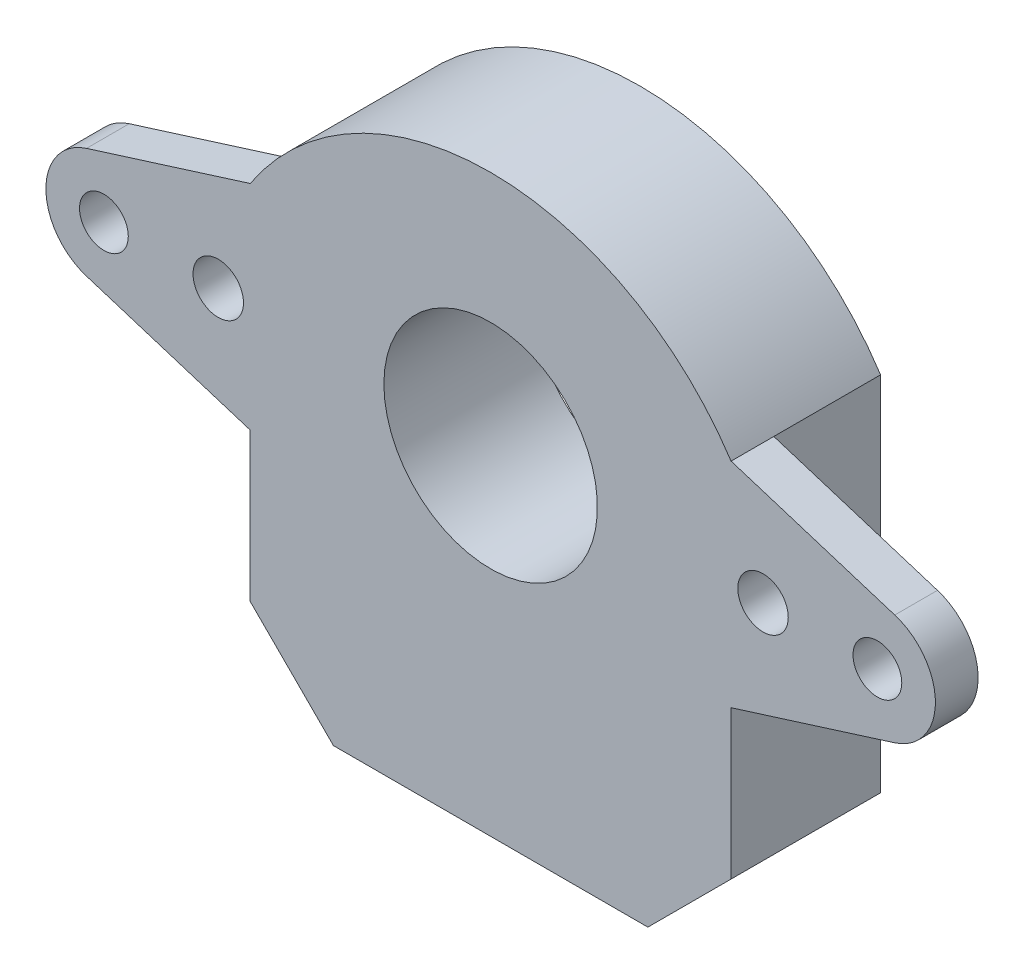
ISO-10303-21;
HEADER;
FILE_DESCRIPTION(('STEP AP214'),'2;1');
FILE_NAME('part.step','',(''),(''),'','','');
FILE_SCHEMA(('AUTOMOTIVE_DESIGN { 1 0 10303 214 1 1 1 1 }'));
ENDSEC;
DATA;
#1=APPLICATION_CONTEXT('core data for automotive mechanical design processes');
#2=APPLICATION_PROTOCOL_DEFINITION('international standard','automotive_design',2000,#1);
#3=PRODUCT_CONTEXT('',#1,'mechanical');
#4=PRODUCT('Part','Part','',(#3));
#5=PRODUCT_RELATED_PRODUCT_CATEGORY('part','',(#4));
#6=PRODUCT_DEFINITION_FORMATION('','',#4);
#7=PRODUCT_DEFINITION_CONTEXT('part definition',#1,'design');
#8=PRODUCT_DEFINITION('design','',#6,#7);
#9=PRODUCT_DEFINITION_SHAPE('','',#8);
#10=(LENGTH_UNIT() NAMED_UNIT(*) SI_UNIT(.MILLI.,.METRE.));
#11=(NAMED_UNIT(*) PLANE_ANGLE_UNIT() SI_UNIT($,.RADIAN.));
#12=(NAMED_UNIT(*) SI_UNIT($,.STERADIAN.) SOLID_ANGLE_UNIT());
#13=UNCERTAINTY_MEASURE_WITH_UNIT(LENGTH_MEASURE(1.E-05),#10,'distance_accuracy_value','');
#14=(GEOMETRIC_REPRESENTATION_CONTEXT(3) GLOBAL_UNCERTAINTY_ASSIGNED_CONTEXT((#13)) GLOBAL_UNIT_ASSIGNED_CONTEXT((#10,
#11,#12)) REPRESENTATION_CONTEXT('',''));
#15=CARTESIAN_POINT('',(0.,0.,0.));
#16=DIRECTION('',(0.,0.,1.));
#17=DIRECTION('',(1.,0.,0.));
#18=AXIS2_PLACEMENT_3D('',#15,#16,#17);
#19=CARTESIAN_POINT('',(14.3,-9.18080428767081,8.89));
#20=DIRECTION('',(-1.,0.,0.));
#21=DIRECTION('',(0.,-1.,0.));
#22=AXIS2_PLACEMENT_3D('',#19,#20,#21);
#23=PLANE('',#22);
#24=DIRECTION('',(0.,1.,0.));
#25=VECTOR('',#24,1.);
#26=CARTESIAN_POINT('',(14.3,0.,6.35));
#27=LINE('',#26,#25);
#28=CARTESIAN_POINT('',(14.3,-0.353985220191791,6.35));
#29=VERTEX_POINT('',#28);
#30=CARTESIAN_POINT('',(14.3,12.3460147798082,6.35));
#31=VERTEX_POINT('',#30);
#32=EDGE_CURVE('E201',#29,#31,#27,.T.);
#33=ORIENTED_EDGE('',*,*,#32,.F.);
#34=DIRECTION('',(0.,0.,1.));
#35=VECTOR('',#34,1.);
#36=CARTESIAN_POINT('',(14.3,-0.353985220191791,6.35));
#37=LINE('',#36,#35);
#38=CARTESIAN_POINT('',(14.3,-0.353985220191791,8.89));
#39=VERTEX_POINT('',#38);
#40=EDGE_CURVE('E229',#29,#39,#37,.T.);
#41=ORIENTED_EDGE('',*,*,#40,.T.);
#42=DIRECTION('',(0.,1.,0.));
#43=VECTOR('',#42,1.);
#44=CARTESIAN_POINT('',(14.3,-9.18080428767081,8.89));
#45=LINE('',#44,#43);
#46=CARTESIAN_POINT('',(14.3,-9.18080428767081,8.89));
#47=VERTEX_POINT('',#46);
#48=EDGE_CURVE('E259',#47,#39,#45,.T.);
#49=ORIENTED_EDGE('',*,*,#48,.F.);
#50=DIRECTION('',(0.,0.,-1.));
#51=VECTOR('',#50,1.);
#52=CARTESIAN_POINT('',(14.3,-9.18080428767081,8.89));
#53=LINE('',#52,#51);
#54=CARTESIAN_POINT('',(14.3,-9.18080428767081,0.));
#55=VERTEX_POINT('',#54);
#56=EDGE_CURVE('E303',#47,#55,#53,.T.);
#57=ORIENTED_EDGE('',*,*,#56,.T.);
#58=DIRECTION('',(0.,1.,0.));
#59=VECTOR('',#58,1.);
#60=CARTESIAN_POINT('',(14.3,-9.18080428767081,0.));
#61=LINE('',#60,#59);
#62=CARTESIAN_POINT('',(14.3,12.3460147798082,0.));
#63=VERTEX_POINT('',#62);
#64=EDGE_CURVE('E280',#55,#63,#61,.T.);
#65=ORIENTED_EDGE('',*,*,#64,.T.);
#66=DIRECTION('',(0.,0.,-1.));
#67=VECTOR('',#66,1.);
#68=CARTESIAN_POINT('',(14.3,12.3460147798082,8.89));
#69=LINE('',#68,#67);
#70=EDGE_CURVE('E298',#31,#63,#69,.T.);
#71=ORIENTED_EDGE('',*,*,#70,.F.);
#72=EDGE_LOOP('',(#33,#41,#49,#57,#65,#71));
#73=FACE_BOUND('',#72,.T.);
#74=ADVANCED_FACE('F41',(#73),#23,.F.);
#75=CARTESIAN_POINT('',(-14.3,-9.18080428767077,8.89));
#76=DIRECTION('',(0.707106781186547,0.707106781186548,0.));
#77=DIRECTION('',(-0.707106781186548,0.707106781186547,0.));
#78=AXIS2_PLACEMENT_3D('',#75,#76,#77);
#79=PLANE('',#78);
#80=DIRECTION('',(0.707106781186548,-0.707106781186547,0.));
#81=VECTOR('',#80,1.);
#82=CARTESIAN_POINT('',(-14.3,-9.18080428767077,0.));
#83=LINE('',#82,#81);
#84=CARTESIAN_POINT('',(-14.3,-9.18080428767077,0.));
#85=VERTEX_POINT('',#84);
#86=CARTESIAN_POINT('',(-9.35025253169415,-14.1305517559766,0.));
#87=VERTEX_POINT('',#86);
#88=EDGE_CURVE('E244',#85,#87,#83,.T.);
#89=ORIENTED_EDGE('',*,*,#88,.T.);
#90=DIRECTION('',(0.,0.,-1.));
#91=VECTOR('',#90,1.);
#92=CARTESIAN_POINT('',(-9.35025253169415,-14.1305517559766,8.89));
#93=LINE('',#92,#91);
#94=CARTESIAN_POINT('',(-9.35025253169415,-14.1305517559766,8.89));
#95=VERTEX_POINT('',#94);
#96=EDGE_CURVE('E11',#95,#87,#93,.T.);
#97=ORIENTED_EDGE('',*,*,#96,.F.);
#98=DIRECTION('',(0.707106781186548,-0.707106781186547,0.));
#99=VECTOR('',#98,1.);
#100=CARTESIAN_POINT('',(-14.3,-9.18080428767077,8.89));
#101=LINE('',#100,#99);
#102=CARTESIAN_POINT('',(-14.3,-9.18080428767077,8.89));
#103=VERTEX_POINT('',#102);
#104=EDGE_CURVE('E248',#103,#95,#101,.T.);
#105=ORIENTED_EDGE('',*,*,#104,.F.);
#106=DIRECTION('',(0.,0.,-1.));
#107=VECTOR('',#106,1.);
#108=CARTESIAN_POINT('',(-14.3,-9.18080428767077,8.89));
#109=LINE('',#108,#107);
#110=EDGE_CURVE('E268',#103,#85,#109,.T.);
#111=ORIENTED_EDGE('',*,*,#110,.T.);
#112=EDGE_LOOP('',(#89,#97,#105,#111));
#113=FACE_BOUND('',#112,.T.);
#114=ADVANCED_FACE('F43',(#113),#79,.F.);
#115=CARTESIAN_POINT('',(-9.35025253169415,-14.1305517559766,8.89));
#116=DIRECTION('',(0.,1.,0.));
#117=DIRECTION('',(-1.,0.,0.));
#118=AXIS2_PLACEMENT_3D('',#115,#116,#117);
#119=PLANE('',#118);
#120=DIRECTION('',(1.,0.,0.));
#121=VECTOR('',#120,1.);
#122=CARTESIAN_POINT('',(-9.35025253169415,-14.1305517559766,0.));
#123=LINE('',#122,#121);
#124=CARTESIAN_POINT('',(9.35025253169415,-14.1305517559766,0.));
#125=VERTEX_POINT('',#124);
#126=EDGE_CURVE('E272',#87,#125,#123,.T.);
#127=ORIENTED_EDGE('',*,*,#126,.T.);
#128=DIRECTION('',(0.,0.,-1.));
#129=VECTOR('',#128,1.);
#130=CARTESIAN_POINT('',(9.35025253169415,-14.1305517559766,8.89));
#131=LINE('',#130,#129);
#132=CARTESIAN_POINT('',(9.35025253169415,-14.1305517559766,8.89));
#133=VERTEX_POINT('',#132);
#134=EDGE_CURVE('E50',#133,#125,#131,.T.);
#135=ORIENTED_EDGE('',*,*,#134,.F.);
#136=DIRECTION('',(1.,0.,0.));
#137=VECTOR('',#136,1.);
#138=CARTESIAN_POINT('',(-9.35025253169415,-14.1305517559766,8.89));
#139=LINE('',#138,#137);
#140=EDGE_CURVE('E251',#95,#133,#139,.T.);
#141=ORIENTED_EDGE('',*,*,#140,.F.);
#142=ORIENTED_EDGE('',*,*,#96,.T.);
#143=EDGE_LOOP('',(#127,#135,#141,#142));
#144=FACE_BOUND('',#143,.T.);
#145=ADVANCED_FACE('F312',(#144),#119,.F.);
#146=CARTESIAN_POINT('',(14.3,-9.18080428767081,8.89));
#147=DIRECTION('',(0.707106781186544,-0.707106781186551,0.));
#148=DIRECTION('',(0.707106781186551,0.707106781186544,0.));
#149=AXIS2_PLACEMENT_3D('',#146,#147,#148);
#150=PLANE('',#149);
#151=DIRECTION('',(-0.707106781186551,-0.707106781186544,0.));
#152=VECTOR('',#151,1.);
#153=CARTESIAN_POINT('',(14.3,-9.18080428767081,0.));
#154=LINE('',#153,#152);
#155=EDGE_CURVE('E276',#55,#125,#154,.T.);
#156=ORIENTED_EDGE('',*,*,#155,.F.);
#157=ORIENTED_EDGE('',*,*,#56,.F.);
#158=DIRECTION('',(-0.707106781186551,-0.707106781186544,0.));
#159=VECTOR('',#158,1.);
#160=CARTESIAN_POINT('',(14.3,-9.18080428767081,8.89));
#161=LINE('',#160,#159);
#162=EDGE_CURVE('E255',#47,#133,#161,.T.);
#163=ORIENTED_EDGE('',*,*,#162,.T.);
#164=ORIENTED_EDGE('',*,*,#134,.T.);
#165=EDGE_LOOP('',(#156,#157,#163,#164));
#166=FACE_BOUND('',#165,.T.);
#167=ADVANCED_FACE('F309',(#166),#150,.T.);
#168=CARTESIAN_POINT('',(0.,2.9694482440234,8.89));
#169=DIRECTION('',(0.,0.,-1.));
#170=DIRECTION('',(-1.,0.,0.));
#171=AXIS2_PLACEMENT_3D('',#168,#169,#170);
#172=CYLINDRICAL_SURFACE('',#171,17.1);
#173=CARTESIAN_POINT('',(0.,2.9694482440234,0.));
#174=DIRECTION('',(0.,0.,1.));
#175=DIRECTION('',(1.,0.,0.));
#176=AXIS2_PLACEMENT_3D('',#173,#174,#175);
#177=CIRCLE('',#176,17.1);
#178=CARTESIAN_POINT('',(-14.3,12.3460147798083,0.));
#179=VERTEX_POINT('',#178);
#180=EDGE_CURVE('E284',#63,#179,#177,.T.);
#181=ORIENTED_EDGE('',*,*,#180,.T.);
#182=DIRECTION('',(0.,0.,-1.));
#183=VECTOR('',#182,1.);
#184=CARTESIAN_POINT('',(-14.3,12.3460147798083,8.89));
#185=LINE('',#184,#183);
#186=CARTESIAN_POINT('',(-14.3,12.3460147798083,6.35));
#187=VERTEX_POINT('',#186);
#188=EDGE_CURVE('E293',#187,#179,#185,.T.);
#189=ORIENTED_EDGE('',*,*,#188,.F.);
#190=CARTESIAN_POINT('',(-14.3,12.3460147798083,8.89));
#191=VERTEX_POINT('',#190);
#192=EDGE_CURVE('E294',#191,#187,#185,.T.);
#193=ORIENTED_EDGE('',*,*,#192,.F.);
#194=CARTESIAN_POINT('',(0.,2.9694482440234,8.89));
#195=DIRECTION('',(0.,0.,1.));
#196=DIRECTION('',(1.,0.,0.));
#197=AXIS2_PLACEMENT_3D('',#194,#195,#196);
#198=CIRCLE('',#197,17.1);
#199=CARTESIAN_POINT('',(14.3,12.3460147798082,8.89));
#200=VERTEX_POINT('',#199);
#201=EDGE_CURVE('E263',#200,#191,#198,.T.);
#202=ORIENTED_EDGE('',*,*,#201,.F.);
#203=EDGE_CURVE('E299',#200,#31,#69,.T.);
#204=ORIENTED_EDGE('',*,*,#203,.T.);
#205=ORIENTED_EDGE('',*,*,#70,.T.);
#206=EDGE_LOOP('',(#181,#189,#193,#202,#204,#205));
#207=FACE_BOUND('',#206,.T.);
#208=ADVANCED_FACE('F332',(#207),#172,.T.);
#209=CARTESIAN_POINT('',(-14.3,-9.18080428767077,8.89));
#210=DIRECTION('',(-1.,0.,0.));
#211=DIRECTION('',(0.,-1.,0.));
#212=AXIS2_PLACEMENT_3D('',#209,#210,#211);
#213=PLANE('',#212);
#214=DIRECTION('',(0.,0.,1.));
#215=VECTOR('',#214,1.);
#216=CARTESIAN_POINT('',(-14.3,-0.353985220191804,6.35));
#217=LINE('',#216,#215);
#218=CARTESIAN_POINT('',(-14.3,-0.353985220191804,6.35));
#219=VERTEX_POINT('',#218);
#220=CARTESIAN_POINT('',(-14.3,-0.353985220191809,8.89));
#221=VERTEX_POINT('',#220);
#222=EDGE_CURVE('E148',#219,#221,#217,.T.);
#223=ORIENTED_EDGE('',*,*,#222,.F.);
#224=DIRECTION('',(0.,-1.,0.));
#225=VECTOR('',#224,1.);
#226=CARTESIAN_POINT('',(-14.3,0.,6.35));
#227=LINE('',#226,#225);
#228=EDGE_CURVE('E57',#187,#219,#227,.T.);
#229=ORIENTED_EDGE('',*,*,#228,.F.);
#230=ORIENTED_EDGE('',*,*,#188,.T.);
#231=DIRECTION('',(0.,1.,0.));
#232=VECTOR('',#231,1.);
#233=CARTESIAN_POINT('',(-14.3,-9.18080428767077,0.));
#234=LINE('',#233,#232);
#235=EDGE_CURVE('E252',#85,#179,#234,.T.);
#236=ORIENTED_EDGE('',*,*,#235,.F.);
#237=ORIENTED_EDGE('',*,*,#110,.F.);
#238=DIRECTION('',(0.,1.,0.));
#239=VECTOR('',#238,1.);
#240=CARTESIAN_POINT('',(-14.3,-9.18080428767077,8.89));
#241=LINE('',#240,#239);
#242=EDGE_CURVE('E63',#103,#221,#241,.T.);
#243=ORIENTED_EDGE('',*,*,#242,.T.);
#244=EDGE_LOOP('',(#223,#229,#230,#236,#237,#243));
#245=FACE_BOUND('',#244,.T.);
#246=ADVANCED_FACE('F328',(#245),#213,.T.);
#247=CARTESIAN_POINT('',(0.,2.9694482440234,8.89));
#248=DIRECTION('',(0.,0.,1.));
#249=DIRECTION('',(1.,0.,0.));
#250=AXIS2_PLACEMENT_3D('',#247,#248,#249);
#251=PLANE('',#250);
#252=CARTESIAN_POINT('',(0.,5.9960147798082,8.89));
#253=DIRECTION('',(0.,0.,-1.));
#254=DIRECTION('',(-1.,0.,0.));
#255=AXIS2_PLACEMENT_3D('',#252,#253,#254);
#256=CIRCLE('',#255,6.35);
#257=CARTESIAN_POINT('',(-6.35,5.9960147798082,8.89));
#258=VERTEX_POINT('',#257);
#259=EDGE_CURVE('E240',#258,#258,#256,.T.);
#260=ORIENTED_EDGE('',*,*,#259,.T.);
#261=EDGE_LOOP('',(#260));
#262=FACE_BOUND('',#261,.T.);
#263=ORIENTED_EDGE('',*,*,#104,.T.);
#264=ORIENTED_EDGE('',*,*,#140,.T.);
#265=ORIENTED_EDGE('',*,*,#162,.F.);
#266=ORIENTED_EDGE('',*,*,#48,.T.);
#267=DIRECTION('',(-0.954012265242667,-0.299767572907004,0.));
#268=VECTOR('',#267,1.);
#269=CARTESIAN_POINT('',(1.38623992851497,-4.41171765694173,8.89));
#270=LINE('',#269,#268);
#271=CARTESIAN_POINT('',(24.0341981265292,2.70467246472101,8.89));
#272=VERTEX_POINT('',#271);
#273=EDGE_CURVE('E166',#272,#39,#270,.T.);
#274=ORIENTED_EDGE('',*,*,#273,.F.);
#275=CARTESIAN_POINT('',(23.,5.99601477980821,8.89));
#276=DIRECTION('',(0.,0.,1.));
#277=DIRECTION('',(1.,0.,0.));
#278=AXIS2_PLACEMENT_3D('',#275,#276,#277);
#279=CIRCLE('',#278,3.45);
#280=CARTESIAN_POINT('',(24.0341981265292,9.28735709489541,8.89));
#281=VERTEX_POINT('',#280);
#282=EDGE_CURVE('E215',#281,#272,#279,.F.);
#283=ORIENTED_EDGE('',*,*,#282,.F.);
#284=DIRECTION('',(-0.954012265242667,0.299767572907003,0.));
#285=VECTOR('',#284,1.);
#286=CARTESIAN_POINT('',(4.81574382180491,15.3261362718968,8.89));
#287=LINE('',#286,#285);
#288=EDGE_CURVE('E218',#281,#200,#287,.T.);
#289=ORIENTED_EDGE('',*,*,#288,.T.);
#290=ORIENTED_EDGE('',*,*,#201,.T.);
#291=DIRECTION('',(0.954012265242667,0.299767572907003,0.));
#292=VECTOR('',#291,1.);
#293=CARTESIAN_POINT('',(-4.81574382180492,15.3261362718968,8.89));
#294=LINE('',#293,#292);
#295=CARTESIAN_POINT('',(-24.0341981265292,9.2873570948954,8.89));
#296=VERTEX_POINT('',#295);
#297=EDGE_CURVE('E162',#296,#191,#294,.T.);
#298=ORIENTED_EDGE('',*,*,#297,.F.);
#299=CARTESIAN_POINT('',(-23.,5.9960147798082,8.89));
#300=DIRECTION('',(0.,0.,1.));
#301=DIRECTION('',(1.,0.,0.));
#302=AXIS2_PLACEMENT_3D('',#299,#300,#301);
#303=CIRCLE('',#302,3.45);
#304=CARTESIAN_POINT('',(-24.0341981265292,2.704672464721,8.89));
#305=VERTEX_POINT('',#304);
#306=EDGE_CURVE('E140',#296,#305,#303,.T.);
#307=ORIENTED_EDGE('',*,*,#306,.T.);
#308=DIRECTION('',(0.954012265242667,-0.299767572907004,0.));
#309=VECTOR('',#308,1.);
#310=CARTESIAN_POINT('',(-1.38623992851496,-4.41171765694172,8.89));
#311=LINE('',#310,#309);
#312=EDGE_CURVE('E151',#305,#221,#311,.T.);
#313=ORIENTED_EDGE('',*,*,#312,.T.);
#314=ORIENTED_EDGE('',*,*,#242,.F.);
#315=EDGE_LOOP('',(#263,#264,#265,#266,#274,#283,#289,#290,#298,#307,#313,#314));
#316=FACE_BOUND('',#315,.T.);
#317=CARTESIAN_POINT('',(16.2,5.99601477980821,8.89));
#318=DIRECTION('',(0.,0.,1.));
#319=DIRECTION('',(1.,0.,0.));
#320=AXIS2_PLACEMENT_3D('',#317,#318,#319);
#321=CIRCLE('',#320,1.5);
#322=CARTESIAN_POINT('',(17.7,5.99601477980821,8.89));
#323=VERTEX_POINT('',#322);
#324=EDGE_CURVE('E222',#323,#323,#321,.F.);
#325=ORIENTED_EDGE('',*,*,#324,.T.);
#326=EDGE_LOOP('',(#325));
#327=FACE_BOUND('',#326,.T.);
#328=CARTESIAN_POINT('',(23.,5.99601477980821,8.89));
#329=DIRECTION('',(0.,0.,1.));
#330=DIRECTION('',(1.,0.,0.));
#331=AXIS2_PLACEMENT_3D('',#328,#329,#330);
#332=CIRCLE('',#331,1.45);
#333=CARTESIAN_POINT('',(24.45,5.99601477980821,8.89));
#334=VERTEX_POINT('',#333);
#335=EDGE_CURVE('E194',#334,#334,#332,.F.);
#336=ORIENTED_EDGE('',*,*,#335,.T.);
#337=EDGE_LOOP('',(#336));
#338=FACE_BOUND('',#337,.T.);
#339=CARTESIAN_POINT('',(-16.2,5.9960147798082,8.89));
#340=DIRECTION('',(0.,0.,1.));
#341=DIRECTION('',(1.,0.,0.));
#342=AXIS2_PLACEMENT_3D('',#339,#340,#341);
#343=CIRCLE('',#342,1.5);
#344=CARTESIAN_POINT('',(-14.7,5.9960147798082,8.89));
#345=VERTEX_POINT('',#344);
#346=EDGE_CURVE('E155',#345,#345,#343,.T.);
#347=ORIENTED_EDGE('',*,*,#346,.F.);
#348=EDGE_LOOP('',(#347));
#349=FACE_BOUND('',#348,.T.);
#350=CARTESIAN_POINT('',(-23.,5.9960147798082,8.89));
#351=DIRECTION('',(0.,0.,1.));
#352=DIRECTION('',(1.,0.,0.));
#353=AXIS2_PLACEMENT_3D('',#350,#351,#352);
#354=CIRCLE('',#353,1.45);
#355=CARTESIAN_POINT('',(-21.55,5.9960147798082,8.89));
#356=VERTEX_POINT('',#355);
#357=EDGE_CURVE('E189',#356,#356,#354,.T.);
#358=ORIENTED_EDGE('',*,*,#357,.F.);
#359=EDGE_LOOP('',(#358));
#360=FACE_BOUND('',#359,.T.);
#361=ADVANCED_FACE('F159',(#262,#316,#327,#338,#349,#360),#251,.T.);
#362=CARTESIAN_POINT('',(0.,2.9694482440234,0.));
#363=DIRECTION('',(0.,0.,1.));
#364=DIRECTION('',(1.,0.,0.));
#365=AXIS2_PLACEMENT_3D('',#362,#363,#364);
#366=PLANE('',#365);
#367=CARTESIAN_POINT('',(0.,5.9960147798082,0.));
#368=DIRECTION('',(0.,0.,-1.));
#369=DIRECTION('',(-1.,0.,0.));
#370=AXIS2_PLACEMENT_3D('',#367,#368,#369);
#371=CIRCLE('',#370,6.35);
#372=CARTESIAN_POINT('',(-6.35,5.9960147798082,0.));
#373=VERTEX_POINT('',#372);
#374=EDGE_CURVE('E233',#373,#373,#371,.T.);
#375=ORIENTED_EDGE('',*,*,#374,.F.);
#376=EDGE_LOOP('',(#375));
#377=FACE_BOUND('',#376,.T.);
#378=ORIENTED_EDGE('',*,*,#88,.F.);
#379=ORIENTED_EDGE('',*,*,#235,.T.);
#380=ORIENTED_EDGE('',*,*,#180,.F.);
#381=ORIENTED_EDGE('',*,*,#64,.F.);
#382=ORIENTED_EDGE('',*,*,#155,.T.);
#383=ORIENTED_EDGE('',*,*,#126,.F.);
#384=EDGE_LOOP('',(#378,#379,#380,#381,#382,#383));
#385=FACE_BOUND('',#384,.T.);
#386=ADVANCED_FACE('F317',(#377,#385),#366,.F.);
#387=CARTESIAN_POINT('',(0.,5.9960147798082,8.89));
#388=DIRECTION('',(0.,0.,-1.));
#389=DIRECTION('',(-1.,0.,0.));
#390=AXIS2_PLACEMENT_3D('',#387,#388,#389);
#391=CYLINDRICAL_SURFACE('',#390,6.35);
#392=ORIENTED_EDGE('',*,*,#259,.F.);
#393=EDGE_LOOP('',(#392));
#394=FACE_BOUND('',#393,.T.);
#395=ORIENTED_EDGE('',*,*,#374,.T.);
#396=EDGE_LOOP('',(#395));
#397=FACE_BOUND('',#396,.T.);
#398=ADVANCED_FACE('F439',(#394,#397),#391,.F.);
#399=CARTESIAN_POINT('',(1.38623992851497,-4.41171765694173,6.35));
#400=DIRECTION('',(-0.299767572907004,0.954012265242667,0.));
#401=DIRECTION('',(-0.954012265242667,-0.299767572907004,0.));
#402=AXIS2_PLACEMENT_3D('',#399,#400,#401);
#403=PLANE('',#402);
#404=ORIENTED_EDGE('',*,*,#273,.T.);
#405=ORIENTED_EDGE('',*,*,#40,.F.);
#406=DIRECTION('',(-0.954012265242667,-0.299767572907004,0.));
#407=VECTOR('',#406,1.);
#408=CARTESIAN_POINT('',(1.38623992851497,-4.41171765694173,6.35));
#409=LINE('',#408,#407);
#410=CARTESIAN_POINT('',(24.0341981265292,2.70467246472101,6.35));
#411=VERTEX_POINT('',#410);
#412=EDGE_CURVE('E190',#411,#29,#409,.T.);
#413=ORIENTED_EDGE('',*,*,#412,.F.);
#414=DIRECTION('',(0.,0.,1.));
#415=VECTOR('',#414,1.);
#416=CARTESIAN_POINT('',(24.0341981265292,2.70467246472101,6.35));
#417=LINE('',#416,#415);
#418=EDGE_CURVE('E212',#411,#272,#417,.T.);
#419=ORIENTED_EDGE('',*,*,#418,.T.);
#420=EDGE_LOOP('',(#404,#405,#413,#419));
#421=FACE_BOUND('',#420,.T.);
#422=ADVANCED_FACE('F346',(#421),#403,.F.);
#423=CARTESIAN_POINT('',(4.81574382180491,15.3261362718968,6.35));
#424=DIRECTION('',(0.299767572907003,0.954012265242667,0.));
#425=DIRECTION('',(-0.954012265242667,0.299767572907003,0.));
#426=AXIS2_PLACEMENT_3D('',#423,#424,#425);
#427=PLANE('',#426);
#428=ORIENTED_EDGE('',*,*,#288,.F.);
#429=DIRECTION('',(0.,0.,1.));
#430=VECTOR('',#429,1.);
#431=CARTESIAN_POINT('',(24.0341981265292,9.28735709489541,6.35));
#432=LINE('',#431,#430);
#433=CARTESIAN_POINT('',(24.0341981265292,9.28735709489541,6.35));
#434=VERTEX_POINT('',#433);
#435=EDGE_CURVE('E234',#434,#281,#432,.T.);
#436=ORIENTED_EDGE('',*,*,#435,.F.);
#437=DIRECTION('',(-0.954012265242667,0.299767572907003,0.));
#438=VECTOR('',#437,1.);
#439=CARTESIAN_POINT('',(4.81574382180491,15.3261362718968,6.35));
#440=LINE('',#439,#438);
#441=EDGE_CURVE('E197',#434,#31,#440,.T.);
#442=ORIENTED_EDGE('',*,*,#441,.T.);
#443=ORIENTED_EDGE('',*,*,#203,.F.);
#444=EDGE_LOOP('',(#428,#436,#442,#443));
#445=FACE_BOUND('',#444,.T.);
#446=ADVANCED_FACE('F337',(#445),#427,.T.);
#447=CARTESIAN_POINT('',(16.2,5.99601477980821,6.35));
#448=DIRECTION('',(0.,0.,1.));
#449=DIRECTION('',(1.,0.,0.));
#450=AXIS2_PLACEMENT_3D('',#447,#448,#449);
#451=CYLINDRICAL_SURFACE('',#450,1.5);
#452=CARTESIAN_POINT('',(16.2,5.99601477980821,6.35));
#453=DIRECTION('',(0.,0.,1.));
#454=DIRECTION('',(1.,0.,0.));
#455=AXIS2_PLACEMENT_3D('',#452,#453,#454);
#456=CIRCLE('',#455,1.5);
#457=CARTESIAN_POINT('',(17.7,5.99601477980821,6.35));
#458=VERTEX_POINT('',#457);
#459=EDGE_CURVE('E204',#458,#458,#456,.F.);
#460=ORIENTED_EDGE('',*,*,#459,.T.);
#461=EDGE_LOOP('',(#460));
#462=FACE_BOUND('',#461,.T.);
#463=ORIENTED_EDGE('',*,*,#324,.F.);
#464=EDGE_LOOP('',(#463));
#465=FACE_BOUND('',#464,.T.);
#466=ADVANCED_FACE('F459',(#462,#465),#451,.F.);
#467=CARTESIAN_POINT('',(23.,5.99601477980821,6.35));
#468=DIRECTION('',(0.,0.,1.));
#469=DIRECTION('',(1.,0.,0.));
#470=AXIS2_PLACEMENT_3D('',#467,#468,#469);
#471=CYLINDRICAL_SURFACE('',#470,3.45);
#472=ORIENTED_EDGE('',*,*,#282,.T.);
#473=ORIENTED_EDGE('',*,*,#418,.F.);
#474=CARTESIAN_POINT('',(23.,5.99601477980821,6.35));
#475=DIRECTION('',(0.,0.,1.));
#476=DIRECTION('',(1.,0.,0.));
#477=AXIS2_PLACEMENT_3D('',#474,#475,#476);
#478=CIRCLE('',#477,3.45);
#479=EDGE_CURVE('E193',#434,#411,#478,.F.);
#480=ORIENTED_EDGE('',*,*,#479,.F.);
#481=ORIENTED_EDGE('',*,*,#435,.T.);
#482=EDGE_LOOP('',(#472,#473,#480,#481));
#483=FACE_BOUND('',#482,.T.);
#484=ADVANCED_FACE('F342',(#483),#471,.T.);
#485=CARTESIAN_POINT('',(23.,5.99601477980821,6.35));
#486=DIRECTION('',(0.,0.,1.));
#487=DIRECTION('',(1.,0.,0.));
#488=AXIS2_PLACEMENT_3D('',#485,#486,#487);
#489=CYLINDRICAL_SURFACE('',#488,1.45);
#490=CARTESIAN_POINT('',(23.,5.99601477980821,6.35));
#491=DIRECTION('',(0.,0.,1.));
#492=DIRECTION('',(1.,0.,0.));
#493=AXIS2_PLACEMENT_3D('',#490,#491,#492);
#494=CIRCLE('',#493,1.45);
#495=CARTESIAN_POINT('',(24.45,5.99601477980821,6.35));
#496=VERTEX_POINT('',#495);
#497=EDGE_CURVE('E208',#496,#496,#494,.F.);
#498=ORIENTED_EDGE('',*,*,#497,.T.);
#499=EDGE_LOOP('',(#498));
#500=FACE_BOUND('',#499,.T.);
#501=ORIENTED_EDGE('',*,*,#335,.F.);
#502=EDGE_LOOP('',(#501));
#503=FACE_BOUND('',#502,.T.);
#504=ADVANCED_FACE('F352',(#500,#503),#489,.F.);
#505=CARTESIAN_POINT('',(0.,0.,6.35));
#506=DIRECTION('',(0.,0.,1.));
#507=DIRECTION('',(1.,0.,0.));
#508=AXIS2_PLACEMENT_3D('',#505,#506,#507);
#509=PLANE('',#508);
#510=ORIENTED_EDGE('',*,*,#412,.T.);
#511=ORIENTED_EDGE('',*,*,#32,.T.);
#512=ORIENTED_EDGE('',*,*,#441,.F.);
#513=ORIENTED_EDGE('',*,*,#479,.T.);
#514=EDGE_LOOP('',(#510,#511,#512,#513));
#515=FACE_BOUND('',#514,.T.);
#516=ORIENTED_EDGE('',*,*,#459,.F.);
#517=EDGE_LOOP('',(#516));
#518=FACE_BOUND('',#517,.T.);
#519=ORIENTED_EDGE('',*,*,#497,.F.);
#520=EDGE_LOOP('',(#519));
#521=FACE_BOUND('',#520,.T.);
#522=ADVANCED_FACE('F348',(#515,#518,#521),#509,.F.);
#523=CARTESIAN_POINT('',(-4.81574382180492,15.3261362718968,6.35));
#524=DIRECTION('',(0.299767572907003,-0.954012265242667,0.));
#525=DIRECTION('',(0.954012265242667,0.299767572907003,0.));
#526=AXIS2_PLACEMENT_3D('',#523,#524,#525);
#527=PLANE('',#526);
#528=ORIENTED_EDGE('',*,*,#297,.T.);
#529=ORIENTED_EDGE('',*,*,#192,.T.);
#530=DIRECTION('',(0.954012265242667,0.299767572907003,0.));
#531=VECTOR('',#530,1.);
#532=CARTESIAN_POINT('',(-4.81574382180492,15.3261362718968,6.35));
#533=LINE('',#532,#531);
#534=CARTESIAN_POINT('',(-24.0341981265292,9.2873570948954,6.35));
#535=VERTEX_POINT('',#534);
#536=EDGE_CURVE('E185',#535,#187,#533,.T.);
#537=ORIENTED_EDGE('',*,*,#536,.F.);
#538=DIRECTION('',(0.,0.,1.));
#539=VECTOR('',#538,1.);
#540=CARTESIAN_POINT('',(-24.0341981265292,9.2873570948954,6.35));
#541=LINE('',#540,#539);
#542=EDGE_CURVE('E147',#535,#296,#541,.T.);
#543=ORIENTED_EDGE('',*,*,#542,.T.);
#544=EDGE_LOOP('',(#528,#529,#537,#543));
#545=FACE_BOUND('',#544,.T.);
#546=ADVANCED_FACE('F351',(#545),#527,.F.);
#547=CARTESIAN_POINT('',(-1.38623992851496,-4.41171765694172,6.35));
#548=DIRECTION('',(-0.299767572907004,-0.954012265242667,0.));
#549=DIRECTION('',(0.954012265242667,-0.299767572907004,0.));
#550=AXIS2_PLACEMENT_3D('',#547,#548,#549);
#551=PLANE('',#550);
#552=ORIENTED_EDGE('',*,*,#312,.F.);
#553=DIRECTION('',(0.,0.,1.));
#554=VECTOR('',#553,1.);
#555=CARTESIAN_POINT('',(-24.0341981265292,2.704672464721,6.35));
#556=LINE('',#555,#554);
#557=CARTESIAN_POINT('',(-24.0341981265292,2.704672464721,6.35));
#558=VERTEX_POINT('',#557);
#559=EDGE_CURVE('E136',#558,#305,#556,.T.);
#560=ORIENTED_EDGE('',*,*,#559,.F.);
#561=DIRECTION('',(0.954012265242667,-0.299767572907004,0.));
#562=VECTOR('',#561,1.);
#563=CARTESIAN_POINT('',(-1.38623992851496,-4.41171765694172,6.35));
#564=LINE('',#563,#562);
#565=EDGE_CURVE('E180',#558,#219,#564,.T.);
#566=ORIENTED_EDGE('',*,*,#565,.T.);
#567=ORIENTED_EDGE('',*,*,#222,.T.);
#568=EDGE_LOOP('',(#552,#560,#566,#567));
#569=FACE_BOUND('',#568,.T.);
#570=ADVANCED_FACE('F152',(#569),#551,.T.);
#571=CARTESIAN_POINT('',(-16.2,5.9960147798082,6.35));
#572=DIRECTION('',(0.,0.,1.));
#573=DIRECTION('',(1.,0.,0.));
#574=AXIS2_PLACEMENT_3D('',#571,#572,#573);
#575=CYLINDRICAL_SURFACE('',#574,1.5);
#576=CARTESIAN_POINT('',(-16.2,5.9960147798082,6.35));
#577=DIRECTION('',(0.,0.,1.));
#578=DIRECTION('',(1.,0.,0.));
#579=AXIS2_PLACEMENT_3D('',#576,#577,#578);
#580=CIRCLE('',#579,1.5);
#581=CARTESIAN_POINT('',(-14.7,5.9960147798082,6.35));
#582=VERTEX_POINT('',#581);
#583=EDGE_CURVE('E174',#582,#582,#580,.T.);
#584=ORIENTED_EDGE('',*,*,#583,.F.);
#585=EDGE_LOOP('',(#584));
#586=FACE_BOUND('',#585,.T.);
#587=ORIENTED_EDGE('',*,*,#346,.T.);
#588=EDGE_LOOP('',(#587));
#589=FACE_BOUND('',#588,.T.);
#590=ADVANCED_FACE('F397',(#586,#589),#575,.F.);
#591=CARTESIAN_POINT('',(-23.,5.9960147798082,6.35));
#592=DIRECTION('',(0.,0.,1.));
#593=DIRECTION('',(1.,0.,0.));
#594=AXIS2_PLACEMENT_3D('',#591,#592,#593);
#595=CYLINDRICAL_SURFACE('',#594,3.45);
#596=ORIENTED_EDGE('',*,*,#306,.F.);
#597=ORIENTED_EDGE('',*,*,#542,.F.);
#598=CARTESIAN_POINT('',(-23.,5.9960147798082,6.35));
#599=DIRECTION('',(0.,0.,1.));
#600=DIRECTION('',(1.,0.,0.));
#601=AXIS2_PLACEMENT_3D('',#598,#599,#600);
#602=CIRCLE('',#601,3.45);
#603=EDGE_CURVE('E142',#535,#558,#602,.T.);
#604=ORIENTED_EDGE('',*,*,#603,.T.);
#605=ORIENTED_EDGE('',*,*,#559,.T.);
#606=EDGE_LOOP('',(#596,#597,#604,#605));
#607=FACE_BOUND('',#606,.T.);
#608=ADVANCED_FACE('F138',(#607),#595,.T.);
#609=CARTESIAN_POINT('',(-23.,5.9960147798082,6.35));
#610=DIRECTION('',(0.,0.,1.));
#611=DIRECTION('',(1.,0.,0.));
#612=AXIS2_PLACEMENT_3D('',#609,#610,#611);
#613=CYLINDRICAL_SURFACE('',#612,1.45);
#614=CARTESIAN_POINT('',(-23.,5.9960147798082,6.35));
#615=DIRECTION('',(0.,0.,1.));
#616=DIRECTION('',(1.,0.,0.));
#617=AXIS2_PLACEMENT_3D('',#614,#615,#616);
#618=CIRCLE('',#617,1.45);
#619=CARTESIAN_POINT('',(-21.55,5.9960147798082,6.35));
#620=VERTEX_POINT('',#619);
#621=EDGE_CURVE('E170',#620,#620,#618,.T.);
#622=ORIENTED_EDGE('',*,*,#621,.F.);
#623=EDGE_LOOP('',(#622));
#624=FACE_BOUND('',#623,.T.);
#625=ORIENTED_EDGE('',*,*,#357,.T.);
#626=EDGE_LOOP('',(#625));
#627=FACE_BOUND('',#626,.T.);
#628=ADVANCED_FACE('F386',(#624,#627),#613,.F.);
#629=CARTESIAN_POINT('',(0.,0.,6.35));
#630=DIRECTION('',(0.,0.,1.));
#631=DIRECTION('',(1.,0.,0.));
#632=AXIS2_PLACEMENT_3D('',#629,#630,#631);
#633=PLANE('',#632);
#634=ORIENTED_EDGE('',*,*,#536,.T.);
#635=ORIENTED_EDGE('',*,*,#228,.T.);
#636=ORIENTED_EDGE('',*,*,#565,.F.);
#637=ORIENTED_EDGE('',*,*,#603,.F.);
#638=EDGE_LOOP('',(#634,#635,#636,#637));
#639=FACE_BOUND('',#638,.T.);
#640=ORIENTED_EDGE('',*,*,#583,.T.);
#641=EDGE_LOOP('',(#640));
#642=FACE_BOUND('',#641,.T.);
#643=ORIENTED_EDGE('',*,*,#621,.T.);
#644=EDGE_LOOP('',(#643));
#645=FACE_BOUND('',#644,.T.);
#646=ADVANCED_FACE('F383',(#639,#642,#645),#633,.F.);
#647=CLOSED_SHELL('',(#74,#114,#145,#167,#208,#246,#361,#386,#398,#422,#446,#466,#484,#504,#522,
#546,#570,#590,#608,#628,#646));
#648=MANIFOLD_SOLID_BREP('B2',#647);
#649=ADVANCED_BREP_SHAPE_REPRESENTATION('',(#18,#648),#14);
#650=SHAPE_DEFINITION_REPRESENTATION(#9,#649);
ENDSEC;
END-ISO-10303-21;
